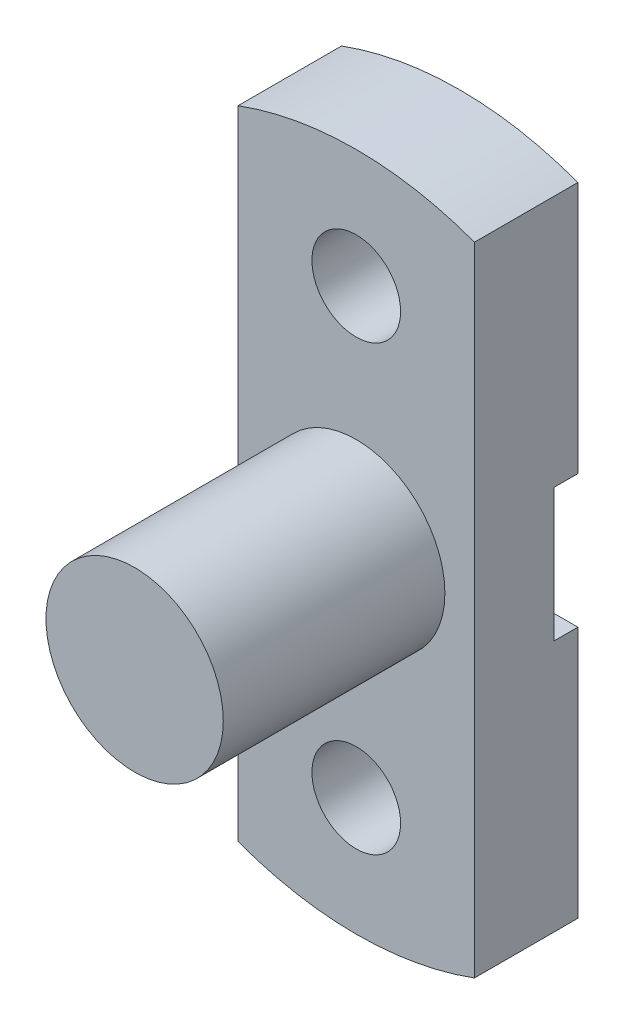
ISO-10303-21;
HEADER;
FILE_DESCRIPTION(('STEP AP214'),'2;1');
FILE_NAME('part.step','',(''),(''),'','','');
FILE_SCHEMA(('AUTOMOTIVE_DESIGN { 1 0 10303 214 1 1 1 1 }'));
ENDSEC;
DATA;
#1=APPLICATION_CONTEXT('core data for automotive mechanical design processes');
#2=APPLICATION_PROTOCOL_DEFINITION('international standard','automotive_design',2000,#1);
#3=PRODUCT_CONTEXT('',#1,'mechanical');
#4=PRODUCT('Part','Part','',(#3));
#5=PRODUCT_RELATED_PRODUCT_CATEGORY('part','',(#4));
#6=PRODUCT_DEFINITION_FORMATION('','',#4);
#7=PRODUCT_DEFINITION_CONTEXT('part definition',#1,'design');
#8=PRODUCT_DEFINITION('design','',#6,#7);
#9=PRODUCT_DEFINITION_SHAPE('','',#8);
#10=(LENGTH_UNIT() NAMED_UNIT(*) SI_UNIT(.MILLI.,.METRE.));
#11=(NAMED_UNIT(*) PLANE_ANGLE_UNIT() SI_UNIT($,.RADIAN.));
#12=(NAMED_UNIT(*) SI_UNIT($,.STERADIAN.) SOLID_ANGLE_UNIT());
#13=UNCERTAINTY_MEASURE_WITH_UNIT(LENGTH_MEASURE(1.E-05),#10,'distance_accuracy_value','');
#14=(GEOMETRIC_REPRESENTATION_CONTEXT(3) GLOBAL_UNCERTAINTY_ASSIGNED_CONTEXT((#13)) GLOBAL_UNIT_ASSIGNED_CONTEXT((#10,
#11,#12)) REPRESENTATION_CONTEXT('',''));
#15=CARTESIAN_POINT('',(0.,0.,0.));
#16=DIRECTION('',(0.,0.,1.));
#17=DIRECTION('',(1.,0.,0.));
#18=AXIS2_PLACEMENT_3D('',#15,#16,#17);
#19=CARTESIAN_POINT('',(0.,0.,0.));
#20=DIRECTION('',(0.,0.,1.));
#21=DIRECTION('',(1.,0.,0.));
#22=AXIS2_PLACEMENT_3D('',#19,#20,#21);
#23=PLANE('',#22);
#24=CARTESIAN_POINT('',(0.,-75.,0.));
#25=DIRECTION('',(0.,0.,1.));
#26=DIRECTION('',(1.,0.,0.));
#27=AXIS2_PLACEMENT_3D('',#24,#25,#26);
#28=CIRCLE('',#27,15.);
#29=CARTESIAN_POINT('',(15.,-75.,0.));
#30=VERTEX_POINT('',#29);
#31=EDGE_CURVE('E140',#30,#30,#28,.T.);
#32=ORIENTED_EDGE('',*,*,#31,.T.);
#33=EDGE_LOOP('',(#32));
#34=FACE_BOUND('',#33,.T.);
#35=DIRECTION('',(0.,-1.,0.));
#36=VECTOR('',#35,1.);
#37=CARTESIAN_POINT('',(-40.,107.819293264239,0.));
#38=LINE('',#37,#36);
#39=CARTESIAN_POINT('',(-40.,-22.5,0.));
#40=VERTEX_POINT('',#39);
#41=CARTESIAN_POINT('',(-40.,-107.819293264239,0.));
#42=VERTEX_POINT('',#41);
#43=EDGE_CURVE('E163',#40,#42,#38,.T.);
#44=ORIENTED_EDGE('',*,*,#43,.F.);
#45=DIRECTION('',(1.,0.,0.));
#46=VECTOR('',#45,1.);
#47=CARTESIAN_POINT('',(-75.,-22.5,0.));
#48=LINE('',#47,#46);
#49=CARTESIAN_POINT('',(40.,-22.5,0.));
#50=VERTEX_POINT('',#49);
#51=EDGE_CURVE('E129',#40,#50,#48,.T.);
#52=ORIENTED_EDGE('',*,*,#51,.T.);
#53=DIRECTION('',(0.,1.,0.));
#54=VECTOR('',#53,1.);
#55=CARTESIAN_POINT('',(40.,107.819293264239,0.));
#56=LINE('',#55,#54);
#57=CARTESIAN_POINT('',(40.,-107.819293264239,0.));
#58=VERTEX_POINT('',#57);
#59=EDGE_CURVE('E155',#58,#50,#56,.T.);
#60=ORIENTED_EDGE('',*,*,#59,.F.);
#61=CARTESIAN_POINT('',(0.,0.,0.));
#62=DIRECTION('',(0.,0.,1.));
#63=DIRECTION('',(1.,0.,0.));
#64=AXIS2_PLACEMENT_3D('',#61,#62,#63);
#65=CIRCLE('',#64,115.);
#66=EDGE_CURVE('E167',#42,#58,#65,.T.);
#67=ORIENTED_EDGE('',*,*,#66,.F.);
#68=EDGE_LOOP('',(#44,#52,#60,#67));
#69=FACE_BOUND('',#68,.T.);
#70=ADVANCED_FACE('F33',(#34,#69),#23,.F.);
#71=CARTESIAN_POINT('',(0.,0.,35.));
#72=DIRECTION('',(0.,0.,1.));
#73=DIRECTION('',(1.,0.,0.));
#74=AXIS2_PLACEMENT_3D('',#71,#72,#73);
#75=PLANE('',#74);
#76=CARTESIAN_POINT('',(0.,0.,35.));
#77=DIRECTION('',(0.,0.,1.));
#78=DIRECTION('',(1.,0.,0.));
#79=AXIS2_PLACEMENT_3D('',#76,#77,#78);
#80=CIRCLE('',#79,30.);
#81=CARTESIAN_POINT('',(30.,0.,35.));
#82=VERTEX_POINT('',#81);
#83=EDGE_CURVE('E241',#82,#82,#80,.T.);
#84=ORIENTED_EDGE('',*,*,#83,.F.);
#85=EDGE_LOOP('',(#84));
#86=FACE_BOUND('',#85,.T.);
#87=CARTESIAN_POINT('',(0.,75.,35.));
#88=DIRECTION('',(0.,0.,1.));
#89=DIRECTION('',(1.,0.,0.));
#90=AXIS2_PLACEMENT_3D('',#87,#88,#89);
#91=CIRCLE('',#90,15.);
#92=CARTESIAN_POINT('',(15.,75.,35.));
#93=VERTEX_POINT('',#92);
#94=EDGE_CURVE('E147',#93,#93,#91,.T.);
#95=ORIENTED_EDGE('',*,*,#94,.F.);
#96=EDGE_LOOP('',(#95));
#97=FACE_BOUND('',#96,.T.);
#98=CARTESIAN_POINT('',(0.,0.,35.));
#99=DIRECTION('',(0.,0.,1.));
#100=DIRECTION('',(1.,0.,0.));
#101=AXIS2_PLACEMENT_3D('',#98,#99,#100);
#102=CIRCLE('',#101,115.);
#103=CARTESIAN_POINT('',(40.,107.819293264239,35.));
#104=VERTEX_POINT('',#103);
#105=CARTESIAN_POINT('',(-40.,107.819293264239,35.));
#106=VERTEX_POINT('',#105);
#107=EDGE_CURVE('E153',#104,#106,#102,.T.);
#108=ORIENTED_EDGE('',*,*,#107,.T.);
#109=DIRECTION('',(0.,-1.,0.));
#110=VECTOR('',#109,1.);
#111=CARTESIAN_POINT('',(-40.,107.819293264239,35.));
#112=LINE('',#111,#110);
#113=CARTESIAN_POINT('',(-40.,-107.819293264239,35.));
#114=VERTEX_POINT('',#113);
#115=EDGE_CURVE('E84',#106,#114,#112,.T.);
#116=ORIENTED_EDGE('',*,*,#115,.T.);
#117=CARTESIAN_POINT('',(0.,0.,35.));
#118=DIRECTION('',(0.,0.,1.));
#119=DIRECTION('',(1.,0.,0.));
#120=AXIS2_PLACEMENT_3D('',#117,#118,#119);
#121=CIRCLE('',#120,115.);
#122=CARTESIAN_POINT('',(40.,-107.819293264239,35.));
#123=VERTEX_POINT('',#122);
#124=EDGE_CURVE('E157',#114,#123,#121,.T.);
#125=ORIENTED_EDGE('',*,*,#124,.T.);
#126=DIRECTION('',(0.,1.,0.));
#127=VECTOR('',#126,1.);
#128=CARTESIAN_POINT('',(40.,107.819293264239,35.));
#129=LINE('',#128,#127);
#130=EDGE_CURVE('E57',#123,#104,#129,.T.);
#131=ORIENTED_EDGE('',*,*,#130,.T.);
#132=EDGE_LOOP('',(#108,#116,#125,#131));
#133=FACE_BOUND('',#132,.T.);
#134=CARTESIAN_POINT('',(0.,-75.,35.));
#135=DIRECTION('',(0.,0.,1.));
#136=DIRECTION('',(1.,0.,0.));
#137=AXIS2_PLACEMENT_3D('',#134,#135,#136);
#138=CIRCLE('',#137,15.);
#139=CARTESIAN_POINT('',(15.,-75.,35.));
#140=VERTEX_POINT('',#139);
#141=EDGE_CURVE('E141',#140,#140,#138,.T.);
#142=ORIENTED_EDGE('',*,*,#141,.F.);
#143=EDGE_LOOP('',(#142));
#144=FACE_BOUND('',#143,.T.);
#145=ADVANCED_FACE('F186',(#86,#97,#133,#144),#75,.T.);
#146=CARTESIAN_POINT('',(40.,22.5,0.));
#147=VERTEX_POINT('',#146);
#148=CARTESIAN_POINT('',(40.,107.819293264239,0.));
#149=VERTEX_POINT('',#148);
#150=EDGE_CURVE('E77',#147,#149,#56,.T.);
#151=ORIENTED_EDGE('',*,*,#150,.F.);
#152=DIRECTION('',(1.,0.,0.));
#153=VECTOR('',#152,1.);
#154=CARTESIAN_POINT('',(-75.,22.5,0.));
#155=LINE('',#154,#153);
#156=CARTESIAN_POINT('',(-40.,22.5,0.));
#157=VERTEX_POINT('',#156);
#158=EDGE_CURVE('E48',#157,#147,#155,.T.);
#159=ORIENTED_EDGE('',*,*,#158,.F.);
#160=CARTESIAN_POINT('',(-40.,107.819293264239,0.));
#161=VERTEX_POINT('',#160);
#162=EDGE_CURVE('E164',#161,#157,#38,.T.);
#163=ORIENTED_EDGE('',*,*,#162,.F.);
#164=CARTESIAN_POINT('',(0.,0.,0.));
#165=DIRECTION('',(0.,0.,1.));
#166=DIRECTION('',(1.,0.,0.));
#167=AXIS2_PLACEMENT_3D('',#164,#165,#166);
#168=CIRCLE('',#167,115.);
#169=EDGE_CURVE('E150',#149,#161,#168,.T.);
#170=ORIENTED_EDGE('',*,*,#169,.F.);
#171=EDGE_LOOP('',(#151,#159,#163,#170));
#172=FACE_BOUND('',#171,.T.);
#173=CARTESIAN_POINT('',(0.,75.,0.));
#174=DIRECTION('',(0.,0.,1.));
#175=DIRECTION('',(1.,0.,0.));
#176=AXIS2_PLACEMENT_3D('',#173,#174,#175);
#177=CIRCLE('',#176,15.);
#178=CARTESIAN_POINT('',(15.,75.,0.));
#179=VERTEX_POINT('',#178);
#180=EDGE_CURVE('E144',#179,#179,#177,.T.);
#181=ORIENTED_EDGE('',*,*,#180,.T.);
#182=EDGE_LOOP('',(#181));
#183=FACE_BOUND('',#182,.T.);
#184=ADVANCED_FACE('F189',(#172,#183),#23,.F.);
#185=CARTESIAN_POINT('',(0.,0.,35.));
#186=DIRECTION('',(0.,0.,-1.));
#187=DIRECTION('',(-1.,0.,0.));
#188=AXIS2_PLACEMENT_3D('',#185,#186,#187);
#189=CYLINDRICAL_SURFACE('',#188,115.);
#190=ORIENTED_EDGE('',*,*,#169,.T.);
#191=DIRECTION('',(0.,0.,-1.));
#192=VECTOR('',#191,1.);
#193=CARTESIAN_POINT('',(-40.,107.819293264239,35.));
#194=LINE('',#193,#192);
#195=EDGE_CURVE('E11',#106,#161,#194,.T.);
#196=ORIENTED_EDGE('',*,*,#195,.F.);
#197=ORIENTED_EDGE('',*,*,#107,.F.);
#198=DIRECTION('',(0.,0.,-1.));
#199=VECTOR('',#198,1.);
#200=CARTESIAN_POINT('',(40.,107.819293264239,35.));
#201=LINE('',#200,#199);
#202=EDGE_CURVE('E160',#104,#149,#201,.T.);
#203=ORIENTED_EDGE('',*,*,#202,.T.);
#204=EDGE_LOOP('',(#190,#196,#197,#203));
#205=FACE_BOUND('',#204,.T.);
#206=ADVANCED_FACE('F35',(#205),#189,.T.);
#207=CARTESIAN_POINT('',(-40.,107.819293264239,35.));
#208=DIRECTION('',(1.,0.,0.));
#209=DIRECTION('',(0.,1.,0.));
#210=AXIS2_PLACEMENT_3D('',#207,#208,#209);
#211=PLANE('',#210);
#212=DIRECTION('',(0.,-1.,0.));
#213=VECTOR('',#212,1.);
#214=CARTESIAN_POINT('',(-40.,107.819293264239,8.00000000000001));
#215=LINE('',#214,#213);
#216=CARTESIAN_POINT('',(-40.,22.5,8.));
#217=VERTEX_POINT('',#216);
#218=CARTESIAN_POINT('',(-40.,-22.5,7.99999999999999));
#219=VERTEX_POINT('',#218);
#220=EDGE_CURVE('E114',#217,#219,#215,.T.);
#221=ORIENTED_EDGE('',*,*,#220,.T.);
#222=DIRECTION('',(0.,0.,-1.));
#223=VECTOR('',#222,1.);
#224=CARTESIAN_POINT('',(-40.,-22.5,35.));
#225=LINE('',#224,#223);
#226=EDGE_CURVE('E137',#219,#40,#225,.T.);
#227=ORIENTED_EDGE('',*,*,#226,.T.);
#228=ORIENTED_EDGE('',*,*,#43,.T.);
#229=DIRECTION('',(0.,0.,-1.));
#230=VECTOR('',#229,1.);
#231=CARTESIAN_POINT('',(-40.,-107.819293264239,35.));
#232=LINE('',#231,#230);
#233=EDGE_CURVE('E41',#114,#42,#232,.T.);
#234=ORIENTED_EDGE('',*,*,#233,.F.);
#235=ORIENTED_EDGE('',*,*,#115,.F.);
#236=ORIENTED_EDGE('',*,*,#195,.T.);
#237=ORIENTED_EDGE('',*,*,#162,.T.);
#238=DIRECTION('',(0.,0.,1.));
#239=VECTOR('',#238,1.);
#240=CARTESIAN_POINT('',(-40.,22.5,35.));
#241=LINE('',#240,#239);
#242=EDGE_CURVE('E132',#157,#217,#241,.T.);
#243=ORIENTED_EDGE('',*,*,#242,.T.);
#244=EDGE_LOOP('',(#221,#227,#228,#234,#235,#236,#237,#243));
#245=FACE_BOUND('',#244,.T.);
#246=ADVANCED_FACE('F212',(#245),#211,.F.);
#247=CARTESIAN_POINT('',(0.,0.,35.));
#248=DIRECTION('',(0.,0.,-1.));
#249=DIRECTION('',(-1.,0.,0.));
#250=AXIS2_PLACEMENT_3D('',#247,#248,#249);
#251=CYLINDRICAL_SURFACE('',#250,115.);
#252=ORIENTED_EDGE('',*,*,#66,.T.);
#253=DIRECTION('',(0.,0.,-1.));
#254=VECTOR('',#253,1.);
#255=CARTESIAN_POINT('',(40.,-107.819293264239,35.));
#256=LINE('',#255,#254);
#257=EDGE_CURVE('E171',#123,#58,#256,.T.);
#258=ORIENTED_EDGE('',*,*,#257,.F.);
#259=ORIENTED_EDGE('',*,*,#124,.F.);
#260=ORIENTED_EDGE('',*,*,#233,.T.);
#261=EDGE_LOOP('',(#252,#258,#259,#260));
#262=FACE_BOUND('',#261,.T.);
#263=ADVANCED_FACE('F177',(#262),#251,.T.);
#264=CARTESIAN_POINT('',(40.,107.819293264239,35.));
#265=DIRECTION('',(-1.,0.,0.));
#266=DIRECTION('',(0.,-1.,0.));
#267=AXIS2_PLACEMENT_3D('',#264,#265,#266);
#268=PLANE('',#267);
#269=ORIENTED_EDGE('',*,*,#59,.T.);
#270=DIRECTION('',(0.,0.,-1.));
#271=VECTOR('',#270,1.);
#272=CARTESIAN_POINT('',(40.,-22.5,0.));
#273=LINE('',#272,#271);
#274=CARTESIAN_POINT('',(40.,-22.5,7.99999999999999));
#275=VERTEX_POINT('',#274);
#276=EDGE_CURVE('E124',#275,#50,#273,.T.);
#277=ORIENTED_EDGE('',*,*,#276,.F.);
#278=DIRECTION('',(0.,-1.,0.));
#279=VECTOR('',#278,1.);
#280=CARTESIAN_POINT('',(40.,22.5,8.));
#281=LINE('',#280,#279);
#282=CARTESIAN_POINT('',(40.,22.5,8.));
#283=VERTEX_POINT('',#282);
#284=EDGE_CURVE('E111',#283,#275,#281,.T.);
#285=ORIENTED_EDGE('',*,*,#284,.F.);
#286=DIRECTION('',(0.,0.,1.));
#287=VECTOR('',#286,1.);
#288=CARTESIAN_POINT('',(40.,22.5,0.));
#289=LINE('',#288,#287);
#290=EDGE_CURVE('E118',#147,#283,#289,.T.);
#291=ORIENTED_EDGE('',*,*,#290,.F.);
#292=ORIENTED_EDGE('',*,*,#150,.T.);
#293=ORIENTED_EDGE('',*,*,#202,.F.);
#294=ORIENTED_EDGE('',*,*,#130,.F.);
#295=ORIENTED_EDGE('',*,*,#257,.T.);
#296=EDGE_LOOP('',(#269,#277,#285,#291,#292,#293,#294,#295));
#297=FACE_BOUND('',#296,.T.);
#298=ADVANCED_FACE('F123',(#297),#268,.F.);
#299=CARTESIAN_POINT('',(0.,75.,35.));
#300=DIRECTION('',(0.,0.,-1.));
#301=DIRECTION('',(-1.,0.,0.));
#302=AXIS2_PLACEMENT_3D('',#299,#300,#301);
#303=CYLINDRICAL_SURFACE('',#302,15.);
#304=ORIENTED_EDGE('',*,*,#94,.T.);
#305=EDGE_LOOP('',(#304));
#306=FACE_BOUND('',#305,.T.);
#307=ORIENTED_EDGE('',*,*,#180,.F.);
#308=EDGE_LOOP('',(#307));
#309=FACE_BOUND('',#308,.T.);
#310=ADVANCED_FACE('F198',(#306,#309),#303,.F.);
#311=CARTESIAN_POINT('',(0.,-75.,35.));
#312=DIRECTION('',(0.,0.,-1.));
#313=DIRECTION('',(-1.,0.,0.));
#314=AXIS2_PLACEMENT_3D('',#311,#312,#313);
#315=CYLINDRICAL_SURFACE('',#314,15.);
#316=ORIENTED_EDGE('',*,*,#141,.T.);
#317=EDGE_LOOP('',(#316));
#318=FACE_BOUND('',#317,.T.);
#319=ORIENTED_EDGE('',*,*,#31,.F.);
#320=EDGE_LOOP('',(#319));
#321=FACE_BOUND('',#320,.T.);
#322=ADVANCED_FACE('F194',(#318,#321),#315,.F.);
#323=CARTESIAN_POINT('',(-75.,-22.5,0.));
#324=DIRECTION('',(0.,-1.,0.));
#325=DIRECTION('',(0.,0.,-1.));
#326=AXIS2_PLACEMENT_3D('',#323,#324,#325);
#327=PLANE('',#326);
#328=DIRECTION('',(1.,0.,0.));
#329=VECTOR('',#328,1.);
#330=CARTESIAN_POINT('',(-75.,-22.5,7.99999999999999));
#331=LINE('',#330,#329);
#332=EDGE_CURVE('E116',#219,#275,#331,.T.);
#333=ORIENTED_EDGE('',*,*,#332,.T.);
#334=ORIENTED_EDGE('',*,*,#276,.T.);
#335=ORIENTED_EDGE('',*,*,#51,.F.);
#336=ORIENTED_EDGE('',*,*,#226,.F.);
#337=EDGE_LOOP('',(#333,#334,#335,#336));
#338=FACE_BOUND('',#337,.T.);
#339=ADVANCED_FACE('F197',(#338),#327,.F.);
#340=CARTESIAN_POINT('',(-75.,22.5,8.));
#341=DIRECTION('',(0.,0.,1.));
#342=DIRECTION('',(0.,-1.,0.));
#343=AXIS2_PLACEMENT_3D('',#340,#341,#342);
#344=PLANE('',#343);
#345=DIRECTION('',(1.,0.,0.));
#346=VECTOR('',#345,1.);
#347=CARTESIAN_POINT('',(-75.,22.5,8.));
#348=LINE('',#347,#346);
#349=EDGE_CURVE('E107',#217,#283,#348,.T.);
#350=ORIENTED_EDGE('',*,*,#349,.T.);
#351=ORIENTED_EDGE('',*,*,#284,.T.);
#352=ORIENTED_EDGE('',*,*,#332,.F.);
#353=ORIENTED_EDGE('',*,*,#220,.F.);
#354=EDGE_LOOP('',(#350,#351,#352,#353));
#355=FACE_BOUND('',#354,.T.);
#356=ADVANCED_FACE('F108',(#355),#344,.F.);
#357=CARTESIAN_POINT('',(-75.,22.5,0.));
#358=DIRECTION('',(0.,1.,0.));
#359=DIRECTION('',(-1.,0.,0.));
#360=AXIS2_PLACEMENT_3D('',#357,#358,#359);
#361=PLANE('',#360);
#362=ORIENTED_EDGE('',*,*,#158,.T.);
#363=ORIENTED_EDGE('',*,*,#290,.T.);
#364=ORIENTED_EDGE('',*,*,#349,.F.);
#365=ORIENTED_EDGE('',*,*,#242,.F.);
#366=EDGE_LOOP('',(#362,#363,#364,#365));
#367=FACE_BOUND('',#366,.T.);
#368=ADVANCED_FACE('F119',(#367),#361,.F.);
#369=CARTESIAN_POINT('',(0.,0.,110.));
#370=DIRECTION('',(0.,0.,-1.));
#371=DIRECTION('',(-1.,0.,0.));
#372=AXIS2_PLACEMENT_3D('',#369,#370,#371);
#373=CYLINDRICAL_SURFACE('',#372,30.);
#374=CARTESIAN_POINT('',(0.,0.,110.));
#375=DIRECTION('',(0.,0.,1.));
#376=DIRECTION('',(1.,0.,0.));
#377=AXIS2_PLACEMENT_3D('',#374,#375,#376);
#378=CIRCLE('',#377,30.);
#379=CARTESIAN_POINT('',(30.,0.,110.));
#380=VERTEX_POINT('',#379);
#381=EDGE_CURVE('E120',#380,#380,#378,.T.);
#382=ORIENTED_EDGE('',*,*,#381,.F.);
#383=EDGE_LOOP('',(#382));
#384=FACE_BOUND('',#383,.T.);
#385=ORIENTED_EDGE('',*,*,#83,.T.);
#386=EDGE_LOOP('',(#385));
#387=FACE_BOUND('',#386,.T.);
#388=ADVANCED_FACE('F225',(#384,#387),#373,.T.);
#389=CARTESIAN_POINT('',(0.,0.,110.));
#390=DIRECTION('',(0.,0.,1.));
#391=DIRECTION('',(1.,0.,0.));
#392=AXIS2_PLACEMENT_3D('',#389,#390,#391);
#393=PLANE('',#392);
#394=ORIENTED_EDGE('',*,*,#381,.T.);
#395=EDGE_LOOP('',(#394));
#396=FACE_BOUND('',#395,.T.);
#397=ADVANCED_FACE('F233',(#396),#393,.T.);
#398=CLOSED_SHELL('',(#70,#145,#184,#206,#246,#263,#298,#310,#322,#339,#356,#368,#388,#397));
#399=MANIFOLD_SOLID_BREP('B2',#398);
#400=ADVANCED_BREP_SHAPE_REPRESENTATION('',(#18,#399),#14);
#401=SHAPE_DEFINITION_REPRESENTATION(#9,#400);
ENDSEC;
END-ISO-10303-21;
